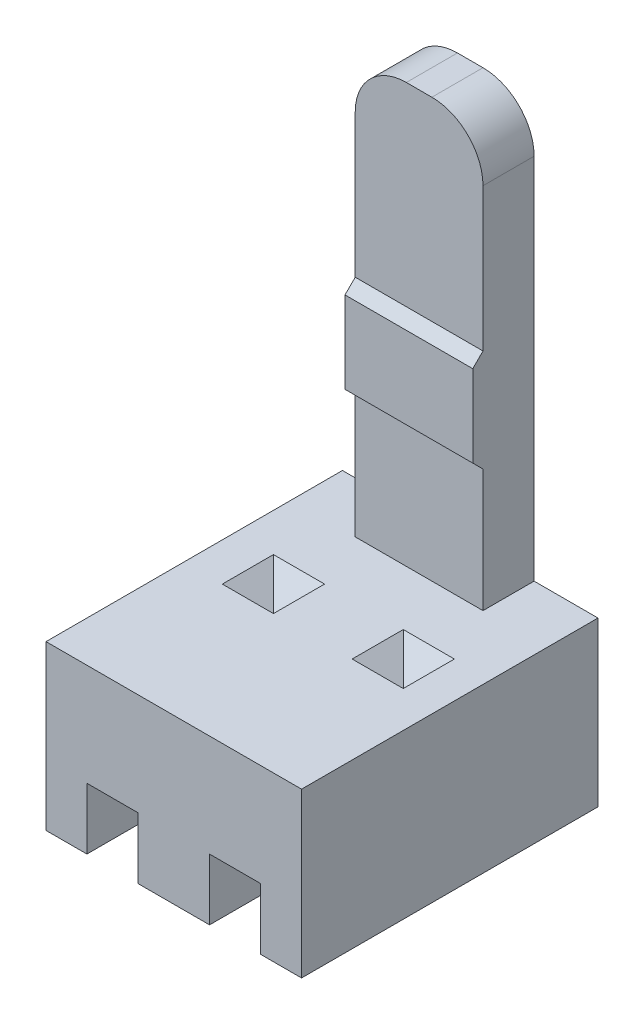
ISO-10303-21;
HEADER;
FILE_DESCRIPTION(('STEP AP214'),'2;1');
FILE_NAME('part.step','',(''),(''),'','','');
FILE_SCHEMA(('AUTOMOTIVE_DESIGN { 1 0 10303 214 1 1 1 1 }'));
ENDSEC;
DATA;
#1=APPLICATION_CONTEXT('core data for automotive mechanical design processes');
#2=APPLICATION_PROTOCOL_DEFINITION('international standard','automotive_design',2000,#1);
#3=PRODUCT_CONTEXT('',#1,'mechanical');
#4=PRODUCT('Part','Part','',(#3));
#5=PRODUCT_RELATED_PRODUCT_CATEGORY('part','',(#4));
#6=PRODUCT_DEFINITION_FORMATION('','',#4);
#7=PRODUCT_DEFINITION_CONTEXT('part definition',#1,'design');
#8=PRODUCT_DEFINITION('design','',#6,#7);
#9=PRODUCT_DEFINITION_SHAPE('','',#8);
#10=(LENGTH_UNIT() NAMED_UNIT(*) SI_UNIT(.MILLI.,.METRE.));
#11=(NAMED_UNIT(*) PLANE_ANGLE_UNIT() SI_UNIT($,.RADIAN.));
#12=(NAMED_UNIT(*) SI_UNIT($,.STERADIAN.) SOLID_ANGLE_UNIT());
#13=UNCERTAINTY_MEASURE_WITH_UNIT(LENGTH_MEASURE(1.E-05),#10,'distance_accuracy_value','');
#14=(GEOMETRIC_REPRESENTATION_CONTEXT(3) GLOBAL_UNCERTAINTY_ASSIGNED_CONTEXT((#13)) GLOBAL_UNIT_ASSIGNED_CONTEXT((#10,
#11,#12)) REPRESENTATION_CONTEXT('',''));
#15=CARTESIAN_POINT('',(0.,0.,0.));
#16=DIRECTION('',(0.,0.,1.));
#17=DIRECTION('',(1.,0.,0.));
#18=AXIS2_PLACEMENT_3D('',#15,#16,#17);
#19=CARTESIAN_POINT('',(1.25,11.4,1.));
#20=DIRECTION('',(0.,0.,-1.));
#21=DIRECTION('',(-1.,0.,0.));
#22=AXIS2_PLACEMENT_3D('',#19,#20,#21);
#23=PLANE('',#22);
#24=DIRECTION('',(1.,0.,0.));
#25=VECTOR('',#24,1.);
#26=CARTESIAN_POINT('',(1.25,5.6,1.));
#27=LINE('',#26,#25);
#28=CARTESIAN_POINT('',(1.25,5.6,1.));
#29=VERTEX_POINT('',#28);
#30=CARTESIAN_POINT('',(3.75,5.6,1.));
#31=VERTEX_POINT('',#30);
#32=EDGE_CURVE('E283',#29,#31,#27,.T.);
#33=ORIENTED_EDGE('',*,*,#32,.F.);
#34=DIRECTION('',(0.,-1.,0.));
#35=VECTOR('',#34,1.);
#36=CARTESIAN_POINT('',(1.25,11.4,1.));
#37=LINE('',#36,#35);
#38=CARTESIAN_POINT('',(1.25,3.2,1.));
#39=VERTEX_POINT('',#38);
#40=EDGE_CURVE('E456',#29,#39,#37,.T.);
#41=ORIENTED_EDGE('',*,*,#40,.T.);
#42=DIRECTION('',(1.,0.,0.));
#43=VECTOR('',#42,1.);
#44=CARTESIAN_POINT('',(1.25,3.2,1.));
#45=LINE('',#44,#43);
#46=CARTESIAN_POINT('',(3.75,3.2,1.));
#47=VERTEX_POINT('',#46);
#48=EDGE_CURVE('E321',#39,#47,#45,.T.);
#49=ORIENTED_EDGE('',*,*,#48,.T.);
#50=DIRECTION('',(0.,-1.,0.));
#51=VECTOR('',#50,1.);
#52=CARTESIAN_POINT('',(3.75,11.4,1.));
#53=LINE('',#52,#51);
#54=EDGE_CURVE('E342',#31,#47,#53,.T.);
#55=ORIENTED_EDGE('',*,*,#54,.F.);
#56=EDGE_LOOP('',(#33,#41,#49,#55));
#57=FACE_BOUND('',#56,.T.);
#58=ADVANCED_FACE('F34',(#57),#23,.F.);
#59=DIRECTION('',(1.,0.,0.));
#60=VECTOR('',#59,1.);
#61=CARTESIAN_POINT('',(1.25,11.4,1.));
#62=LINE('',#61,#60);
#63=CARTESIAN_POINT('',(2.25,11.4,1.));
#64=VERTEX_POINT('',#63);
#65=CARTESIAN_POINT('',(2.75,11.4,1.));
#66=VERTEX_POINT('',#65);
#67=EDGE_CURVE('E313',#64,#66,#62,.T.);
#68=ORIENTED_EDGE('',*,*,#67,.F.);
#69=CARTESIAN_POINT('',(2.25,10.4,1.));
#70=DIRECTION('',(0.,0.,-1.));
#71=DIRECTION('',(-1.,0.,0.));
#72=AXIS2_PLACEMENT_3D('',#69,#70,#71);
#73=CIRCLE('',#72,1.);
#74=CARTESIAN_POINT('',(1.25,10.4,1.));
#75=VERTEX_POINT('',#74);
#76=EDGE_CURVE('E364',#64,#75,#73,.F.);
#77=ORIENTED_EDGE('',*,*,#76,.T.);
#78=CARTESIAN_POINT('',(1.25,7.6,1.));
#79=VERTEX_POINT('',#78);
#80=EDGE_CURVE('E467',#75,#79,#37,.T.);
#81=ORIENTED_EDGE('',*,*,#80,.T.);
#82=DIRECTION('',(-1.,0.,0.));
#83=VECTOR('',#82,1.);
#84=CARTESIAN_POINT('',(1.25,7.6,1.));
#85=LINE('',#84,#83);
#86=CARTESIAN_POINT('',(3.75,7.6,1.));
#87=VERTEX_POINT('',#86);
#88=EDGE_CURVE('E305',#87,#79,#85,.T.);
#89=ORIENTED_EDGE('',*,*,#88,.F.);
#90=CARTESIAN_POINT('',(3.75,10.4,1.));
#91=VERTEX_POINT('',#90);
#92=EDGE_CURVE('E326',#91,#87,#53,.T.);
#93=ORIENTED_EDGE('',*,*,#92,.F.);
#94=CARTESIAN_POINT('',(2.75,10.4,1.));
#95=DIRECTION('',(0.,0.,-1.));
#96=DIRECTION('',(-1.,0.,0.));
#97=AXIS2_PLACEMENT_3D('',#94,#95,#96);
#98=CIRCLE('',#97,1.);
#99=EDGE_CURVE('E365',#91,#66,#98,.F.);
#100=ORIENTED_EDGE('',*,*,#99,.T.);
#101=EDGE_LOOP('',(#68,#77,#81,#89,#93,#100));
#102=FACE_BOUND('',#101,.T.);
#103=ADVANCED_FACE('F525',(#102),#23,.F.);
#104=CARTESIAN_POINT('',(0.,3.2,5.8));
#105=DIRECTION('',(0.,-1.,0.));
#106=DIRECTION('',(0.,0.,-1.));
#107=AXIS2_PLACEMENT_3D('',#104,#105,#106);
#108=PLANE('',#107);
#109=DIRECTION('',(1.,0.,0.));
#110=VECTOR('',#109,1.);
#111=CARTESIAN_POINT('',(3.29,3.2,3.1));
#112=LINE('',#111,#110);
#113=CARTESIAN_POINT('',(3.29,3.2,3.1));
#114=VERTEX_POINT('',#113);
#115=CARTESIAN_POINT('',(4.29,3.2,3.1));
#116=VERTEX_POINT('',#115);
#117=EDGE_CURVE('E245',#114,#116,#112,.T.);
#118=ORIENTED_EDGE('',*,*,#117,.F.);
#119=DIRECTION('',(0.,0.,1.));
#120=VECTOR('',#119,1.);
#121=CARTESIAN_POINT('',(3.29,3.2,2.1));
#122=LINE('',#121,#120);
#123=CARTESIAN_POINT('',(3.29,3.2,2.1));
#124=VERTEX_POINT('',#123);
#125=EDGE_CURVE('E49',#124,#114,#122,.T.);
#126=ORIENTED_EDGE('',*,*,#125,.F.);
#127=DIRECTION('',(-1.,0.,0.));
#128=VECTOR('',#127,1.);
#129=CARTESIAN_POINT('',(3.29,3.2,2.1));
#130=LINE('',#129,#128);
#131=CARTESIAN_POINT('',(4.29,3.2,2.1));
#132=VERTEX_POINT('',#131);
#133=EDGE_CURVE('E252',#132,#124,#130,.T.);
#134=ORIENTED_EDGE('',*,*,#133,.F.);
#135=DIRECTION('',(0.,0.,-1.));
#136=VECTOR('',#135,1.);
#137=CARTESIAN_POINT('',(4.29,3.2,2.1));
#138=LINE('',#137,#136);
#139=EDGE_CURVE('E234',#116,#132,#138,.T.);
#140=ORIENTED_EDGE('',*,*,#139,.F.);
#141=EDGE_LOOP('',(#118,#126,#134,#140));
#142=FACE_BOUND('',#141,.T.);
#143=DIRECTION('',(1.,0.,0.));
#144=VECTOR('',#143,1.);
#145=CARTESIAN_POINT('',(0.750000000000003,3.2,3.1));
#146=LINE('',#145,#144);
#147=CARTESIAN_POINT('',(0.750000000000003,3.2,3.1));
#148=VERTEX_POINT('',#147);
#149=CARTESIAN_POINT('',(1.75,3.2,3.1));
#150=VERTEX_POINT('',#149);
#151=EDGE_CURVE('E271',#148,#150,#146,.T.);
#152=ORIENTED_EDGE('',*,*,#151,.F.);
#153=DIRECTION('',(0.,0.,1.));
#154=VECTOR('',#153,1.);
#155=CARTESIAN_POINT('',(0.750000000000003,3.2,2.1));
#156=LINE('',#155,#154);
#157=CARTESIAN_POINT('',(0.750000000000003,3.2,2.1));
#158=VERTEX_POINT('',#157);
#159=EDGE_CURVE('E57',#158,#148,#156,.T.);
#160=ORIENTED_EDGE('',*,*,#159,.F.);
#161=DIRECTION('',(-1.,0.,0.));
#162=VECTOR('',#161,1.);
#163=CARTESIAN_POINT('',(0.750000000000003,3.2,2.1));
#164=LINE('',#163,#162);
#165=CARTESIAN_POINT('',(1.75,3.2,2.1));
#166=VERTEX_POINT('',#165);
#167=EDGE_CURVE('E277',#166,#158,#164,.T.);
#168=ORIENTED_EDGE('',*,*,#167,.F.);
#169=DIRECTION('',(0.,0.,-1.));
#170=VECTOR('',#169,1.);
#171=CARTESIAN_POINT('',(1.75,3.2,2.1));
#172=LINE('',#171,#170);
#173=EDGE_CURVE('E274',#150,#166,#172,.T.);
#174=ORIENTED_EDGE('',*,*,#173,.F.);
#175=EDGE_LOOP('',(#152,#160,#168,#174));
#176=FACE_BOUND('',#175,.T.);
#177=DIRECTION('',(0.,0.,1.));
#178=VECTOR('',#177,1.);
#179=CARTESIAN_POINT('',(1.25,3.2,0.));
#180=LINE('',#179,#178);
#181=CARTESIAN_POINT('',(1.25,3.2,0.));
#182=VERTEX_POINT('',#181);
#183=EDGE_CURVE('E308',#182,#39,#180,.T.);
#184=ORIENTED_EDGE('',*,*,#183,.F.);
#185=DIRECTION('',(-1.,0.,0.));
#186=VECTOR('',#185,1.);
#187=CARTESIAN_POINT('',(0.,3.2,0.));
#188=LINE('',#187,#186);
#189=CARTESIAN_POINT('',(0.,3.2,0.));
#190=VERTEX_POINT('',#189);
#191=EDGE_CURVE('E381',#182,#190,#188,.T.);
#192=ORIENTED_EDGE('',*,*,#191,.T.);
#193=DIRECTION('',(0.,0.,-1.));
#194=VECTOR('',#193,1.);
#195=CARTESIAN_POINT('',(0.,3.2,5.8));
#196=LINE('',#195,#194);
#197=CARTESIAN_POINT('',(0.,3.2,5.8));
#198=VERTEX_POINT('',#197);
#199=EDGE_CURVE('E406',#198,#190,#196,.T.);
#200=ORIENTED_EDGE('',*,*,#199,.F.);
#201=DIRECTION('',(-1.,0.,0.));
#202=VECTOR('',#201,1.);
#203=CARTESIAN_POINT('',(0.,3.2,5.8));
#204=LINE('',#203,#202);
#205=CARTESIAN_POINT('',(5.,3.2,5.8));
#206=VERTEX_POINT('',#205);
#207=EDGE_CURVE('E490',#206,#198,#204,.T.);
#208=ORIENTED_EDGE('',*,*,#207,.F.);
#209=DIRECTION('',(0.,0.,-1.));
#210=VECTOR('',#209,1.);
#211=CARTESIAN_POINT('',(5.,3.2,5.8));
#212=LINE('',#211,#210);
#213=CARTESIAN_POINT('',(5.,3.2,0.));
#214=VERTEX_POINT('',#213);
#215=EDGE_CURVE('E409',#206,#214,#212,.T.);
#216=ORIENTED_EDGE('',*,*,#215,.T.);
#217=CARTESIAN_POINT('',(3.75,3.2,0.));
#218=VERTEX_POINT('',#217);
#219=EDGE_CURVE('E388',#214,#218,#188,.T.);
#220=ORIENTED_EDGE('',*,*,#219,.T.);
#221=DIRECTION('',(0.,0.,-1.));
#222=VECTOR('',#221,1.);
#223=CARTESIAN_POINT('',(3.75,3.2,0.));
#224=LINE('',#223,#222);
#225=EDGE_CURVE('E317',#47,#218,#224,.T.);
#226=ORIENTED_EDGE('',*,*,#225,.F.);
#227=ORIENTED_EDGE('',*,*,#48,.F.);
#228=EDGE_LOOP('',(#184,#192,#200,#208,#216,#220,#226,#227));
#229=FACE_BOUND('',#228,.T.);
#230=ADVANCED_FACE('F249',(#142,#176,#229),#108,.F.);
#231=CARTESIAN_POINT('',(0.8,0.,5.8));
#232=DIRECTION('',(0.,1.,0.));
#233=DIRECTION('',(-1.,0.,0.));
#234=AXIS2_PLACEMENT_3D('',#231,#232,#233);
#235=PLANE('',#234);
#236=DIRECTION('',(1.,0.,0.));
#237=VECTOR('',#236,1.);
#238=CARTESIAN_POINT('',(0.8,0.,0.));
#239=LINE('',#238,#237);
#240=CARTESIAN_POINT('',(0.,0.,0.));
#241=VERTEX_POINT('',#240);
#242=CARTESIAN_POINT('',(0.8,0.,0.));
#243=VERTEX_POINT('',#242);
#244=EDGE_CURVE('E468',#241,#243,#239,.T.);
#245=ORIENTED_EDGE('',*,*,#244,.T.);
#246=DIRECTION('',(0.,0.,-1.));
#247=VECTOR('',#246,1.);
#248=CARTESIAN_POINT('',(0.8,0.,5.8));
#249=LINE('',#248,#247);
#250=CARTESIAN_POINT('',(0.8,0.,5.8));
#251=VERTEX_POINT('',#250);
#252=EDGE_CURVE('E435',#251,#243,#249,.T.);
#253=ORIENTED_EDGE('',*,*,#252,.F.);
#254=DIRECTION('',(1.,0.,0.));
#255=VECTOR('',#254,1.);
#256=CARTESIAN_POINT('',(0.8,0.,5.8));
#257=LINE('',#256,#255);
#258=CARTESIAN_POINT('',(0.,0.,5.8));
#259=VERTEX_POINT('',#258);
#260=EDGE_CURVE('E402',#259,#251,#257,.T.);
#261=ORIENTED_EDGE('',*,*,#260,.F.);
#262=DIRECTION('',(0.,0.,-1.));
#263=VECTOR('',#262,1.);
#264=CARTESIAN_POINT('',(0.,0.,5.8));
#265=LINE('',#264,#263);
#266=EDGE_CURVE('E403',#259,#241,#265,.T.);
#267=ORIENTED_EDGE('',*,*,#266,.T.);
#268=EDGE_LOOP('',(#245,#253,#261,#267));
#269=FACE_BOUND('',#268,.T.);
#270=ADVANCED_FACE('F558',(#269),#235,.F.);
#271=CARTESIAN_POINT('',(0.8,1.2,5.8));
#272=DIRECTION('',(-1.,0.,0.));
#273=DIRECTION('',(0.,-1.,0.));
#274=AXIS2_PLACEMENT_3D('',#271,#272,#273);
#275=PLANE('',#274);
#276=DIRECTION('',(0.,1.,0.));
#277=VECTOR('',#276,1.);
#278=CARTESIAN_POINT('',(0.8,1.2,0.));
#279=LINE('',#278,#277);
#280=CARTESIAN_POINT('',(0.8,1.2,0.));
#281=VERTEX_POINT('',#280);
#282=EDGE_CURVE('E494',#243,#281,#279,.T.);
#283=ORIENTED_EDGE('',*,*,#282,.T.);
#284=DIRECTION('',(0.,0.,-1.));
#285=VECTOR('',#284,1.);
#286=CARTESIAN_POINT('',(0.8,1.2,5.8));
#287=LINE('',#286,#285);
#288=CARTESIAN_POINT('',(0.8,1.2,5.8));
#289=VERTEX_POINT('',#288);
#290=EDGE_CURVE('E433',#289,#281,#287,.T.);
#291=ORIENTED_EDGE('',*,*,#290,.F.);
#292=DIRECTION('',(0.,1.,0.));
#293=VECTOR('',#292,1.);
#294=CARTESIAN_POINT('',(0.8,1.2,5.8));
#295=LINE('',#294,#293);
#296=EDGE_CURVE('E472',#251,#289,#295,.T.);
#297=ORIENTED_EDGE('',*,*,#296,.F.);
#298=ORIENTED_EDGE('',*,*,#252,.T.);
#299=EDGE_LOOP('',(#283,#291,#297,#298));
#300=FACE_BOUND('',#299,.T.);
#301=ADVANCED_FACE('F586',(#300),#275,.F.);
#302=CARTESIAN_POINT('',(1.8,1.2,5.8));
#303=DIRECTION('',(0.,1.,0.));
#304=DIRECTION('',(-1.,0.,0.));
#305=AXIS2_PLACEMENT_3D('',#302,#303,#304);
#306=PLANE('',#305);
#307=DIRECTION('',(1.,0.,0.));
#308=VECTOR('',#307,1.);
#309=CARTESIAN_POINT('',(1.8,1.2,0.));
#310=LINE('',#309,#308);
#311=CARTESIAN_POINT('',(1.8,1.2,0.));
#312=VERTEX_POINT('',#311);
#313=EDGE_CURVE('E496',#281,#312,#310,.T.);
#314=ORIENTED_EDGE('',*,*,#313,.T.);
#315=DIRECTION('',(0.,0.,-1.));
#316=VECTOR('',#315,1.);
#317=CARTESIAN_POINT('',(1.8,1.2,5.8));
#318=LINE('',#317,#316);
#319=CARTESIAN_POINT('',(1.8,1.2,5.8));
#320=VERTEX_POINT('',#319);
#321=EDGE_CURVE('E430',#320,#312,#318,.T.);
#322=ORIENTED_EDGE('',*,*,#321,.F.);
#323=DIRECTION('',(1.,0.,0.));
#324=VECTOR('',#323,1.);
#325=CARTESIAN_POINT('',(1.8,1.2,5.8));
#326=LINE('',#325,#324);
#327=EDGE_CURVE('E474',#289,#320,#326,.T.);
#328=ORIENTED_EDGE('',*,*,#327,.F.);
#329=ORIENTED_EDGE('',*,*,#290,.T.);
#330=EDGE_LOOP('',(#314,#322,#328,#329));
#331=FACE_BOUND('',#330,.T.);
#332=ADVANCED_FACE('F582',(#331),#306,.F.);
#333=CARTESIAN_POINT('',(1.8,0.,5.8));
#334=DIRECTION('',(1.,0.,0.));
#335=DIRECTION('',(0.,0.,-1.));
#336=AXIS2_PLACEMENT_3D('',#333,#334,#335);
#337=PLANE('',#336);
#338=DIRECTION('',(0.,-1.,0.));
#339=VECTOR('',#338,1.);
#340=CARTESIAN_POINT('',(1.8,0.,0.));
#341=LINE('',#340,#339);
#342=CARTESIAN_POINT('',(1.8,0.,0.));
#343=VERTEX_POINT('',#342);
#344=EDGE_CURVE('E498',#312,#343,#341,.T.);
#345=ORIENTED_EDGE('',*,*,#344,.T.);
#346=DIRECTION('',(0.,0.,-1.));
#347=VECTOR('',#346,1.);
#348=CARTESIAN_POINT('',(1.8,0.,5.8));
#349=LINE('',#348,#347);
#350=CARTESIAN_POINT('',(1.8,0.,5.8));
#351=VERTEX_POINT('',#350);
#352=EDGE_CURVE('E427',#351,#343,#349,.T.);
#353=ORIENTED_EDGE('',*,*,#352,.F.);
#354=DIRECTION('',(0.,-1.,0.));
#355=VECTOR('',#354,1.);
#356=CARTESIAN_POINT('',(1.8,0.,5.8));
#357=LINE('',#356,#355);
#358=EDGE_CURVE('E476',#320,#351,#357,.T.);
#359=ORIENTED_EDGE('',*,*,#358,.F.);
#360=ORIENTED_EDGE('',*,*,#321,.T.);
#361=EDGE_LOOP('',(#345,#353,#359,#360));
#362=FACE_BOUND('',#361,.T.);
#363=ADVANCED_FACE('F578',(#362),#337,.F.);
#364=CARTESIAN_POINT('',(3.2,0.,5.8));
#365=DIRECTION('',(0.,1.,0.));
#366=DIRECTION('',(-1.,0.,0.));
#367=AXIS2_PLACEMENT_3D('',#364,#365,#366);
#368=PLANE('',#367);
#369=DIRECTION('',(1.,0.,0.));
#370=VECTOR('',#369,1.);
#371=CARTESIAN_POINT('',(3.2,0.,0.));
#372=LINE('',#371,#370);
#373=CARTESIAN_POINT('',(3.2,0.,0.));
#374=VERTEX_POINT('',#373);
#375=EDGE_CURVE('E500',#343,#374,#372,.T.);
#376=ORIENTED_EDGE('',*,*,#375,.T.);
#377=DIRECTION('',(0.,0.,-1.));
#378=VECTOR('',#377,1.);
#379=CARTESIAN_POINT('',(3.2,0.,5.8));
#380=LINE('',#379,#378);
#381=CARTESIAN_POINT('',(3.2,0.,5.8));
#382=VERTEX_POINT('',#381);
#383=EDGE_CURVE('E424',#382,#374,#380,.T.);
#384=ORIENTED_EDGE('',*,*,#383,.F.);
#385=DIRECTION('',(1.,0.,0.));
#386=VECTOR('',#385,1.);
#387=CARTESIAN_POINT('',(3.2,0.,5.8));
#388=LINE('',#387,#386);
#389=EDGE_CURVE('E478',#351,#382,#388,.T.);
#390=ORIENTED_EDGE('',*,*,#389,.F.);
#391=ORIENTED_EDGE('',*,*,#352,.T.);
#392=EDGE_LOOP('',(#376,#384,#390,#391));
#393=FACE_BOUND('',#392,.T.);
#394=ADVANCED_FACE('F574',(#393),#368,.F.);
#395=CARTESIAN_POINT('',(3.2,1.2,5.8));
#396=DIRECTION('',(-1.,0.,0.));
#397=DIRECTION('',(0.,0.,1.));
#398=AXIS2_PLACEMENT_3D('',#395,#396,#397);
#399=PLANE('',#398);
#400=DIRECTION('',(0.,1.,0.));
#401=VECTOR('',#400,1.);
#402=CARTESIAN_POINT('',(3.2,1.2,0.));
#403=LINE('',#402,#401);
#404=CARTESIAN_POINT('',(3.2,1.2,0.));
#405=VERTEX_POINT('',#404);
#406=EDGE_CURVE('E502',#374,#405,#403,.T.);
#407=ORIENTED_EDGE('',*,*,#406,.T.);
#408=DIRECTION('',(0.,0.,-1.));
#409=VECTOR('',#408,1.);
#410=CARTESIAN_POINT('',(3.2,1.2,5.8));
#411=LINE('',#410,#409);
#412=CARTESIAN_POINT('',(3.2,1.2,5.8));
#413=VERTEX_POINT('',#412);
#414=EDGE_CURVE('E421',#413,#405,#411,.T.);
#415=ORIENTED_EDGE('',*,*,#414,.F.);
#416=DIRECTION('',(0.,1.,0.));
#417=VECTOR('',#416,1.);
#418=CARTESIAN_POINT('',(3.2,1.2,5.8));
#419=LINE('',#418,#417);
#420=EDGE_CURVE('E480',#382,#413,#419,.T.);
#421=ORIENTED_EDGE('',*,*,#420,.F.);
#422=ORIENTED_EDGE('',*,*,#383,.T.);
#423=EDGE_LOOP('',(#407,#415,#421,#422));
#424=FACE_BOUND('',#423,.T.);
#425=ADVANCED_FACE('F570',(#424),#399,.F.);
#426=CARTESIAN_POINT('',(4.2,1.2,5.8));
#427=DIRECTION('',(0.,1.,0.));
#428=DIRECTION('',(-1.,0.,0.));
#429=AXIS2_PLACEMENT_3D('',#426,#427,#428);
#430=PLANE('',#429);
#431=DIRECTION('',(1.,0.,0.));
#432=VECTOR('',#431,1.);
#433=CARTESIAN_POINT('',(4.2,1.2,0.));
#434=LINE('',#433,#432);
#435=CARTESIAN_POINT('',(4.2,1.2,0.));
#436=VERTEX_POINT('',#435);
#437=EDGE_CURVE('E504',#405,#436,#434,.T.);
#438=ORIENTED_EDGE('',*,*,#437,.T.);
#439=DIRECTION('',(0.,0.,-1.));
#440=VECTOR('',#439,1.);
#441=CARTESIAN_POINT('',(4.2,1.2,5.8));
#442=LINE('',#441,#440);
#443=CARTESIAN_POINT('',(4.2,1.2,5.8));
#444=VERTEX_POINT('',#443);
#445=EDGE_CURVE('E418',#444,#436,#442,.T.);
#446=ORIENTED_EDGE('',*,*,#445,.F.);
#447=DIRECTION('',(1.,0.,0.));
#448=VECTOR('',#447,1.);
#449=CARTESIAN_POINT('',(4.2,1.2,5.8));
#450=LINE('',#449,#448);
#451=EDGE_CURVE('E482',#413,#444,#450,.T.);
#452=ORIENTED_EDGE('',*,*,#451,.F.);
#453=ORIENTED_EDGE('',*,*,#414,.T.);
#454=EDGE_LOOP('',(#438,#446,#452,#453));
#455=FACE_BOUND('',#454,.T.);
#456=ADVANCED_FACE('F566',(#455),#430,.F.);
#457=CARTESIAN_POINT('',(4.2,0.,5.8));
#458=DIRECTION('',(1.,0.,0.));
#459=DIRECTION('',(0.,0.,-1.));
#460=AXIS2_PLACEMENT_3D('',#457,#458,#459);
#461=PLANE('',#460);
#462=DIRECTION('',(0.,-1.,0.));
#463=VECTOR('',#462,1.);
#464=CARTESIAN_POINT('',(4.2,0.,0.));
#465=LINE('',#464,#463);
#466=CARTESIAN_POINT('',(4.2,0.,0.));
#467=VERTEX_POINT('',#466);
#468=EDGE_CURVE('E506',#436,#467,#465,.T.);
#469=ORIENTED_EDGE('',*,*,#468,.T.);
#470=DIRECTION('',(0.,0.,-1.));
#471=VECTOR('',#470,1.);
#472=CARTESIAN_POINT('',(4.2,0.,5.8));
#473=LINE('',#472,#471);
#474=CARTESIAN_POINT('',(4.2,0.,5.8));
#475=VERTEX_POINT('',#474);
#476=EDGE_CURVE('E415',#475,#467,#473,.T.);
#477=ORIENTED_EDGE('',*,*,#476,.F.);
#478=DIRECTION('',(0.,-1.,0.));
#479=VECTOR('',#478,1.);
#480=CARTESIAN_POINT('',(4.2,0.,5.8));
#481=LINE('',#480,#479);
#482=EDGE_CURVE('E484',#444,#475,#481,.T.);
#483=ORIENTED_EDGE('',*,*,#482,.F.);
#484=ORIENTED_EDGE('',*,*,#445,.T.);
#485=EDGE_LOOP('',(#469,#477,#483,#484));
#486=FACE_BOUND('',#485,.T.);
#487=ADVANCED_FACE('F563',(#486),#461,.F.);
#488=CARTESIAN_POINT('',(5.,0.,5.8));
#489=DIRECTION('',(0.,1.,0.));
#490=DIRECTION('',(-1.,0.,0.));
#491=AXIS2_PLACEMENT_3D('',#488,#489,#490);
#492=PLANE('',#491);
#493=DIRECTION('',(1.,0.,0.));
#494=VECTOR('',#493,1.);
#495=CARTESIAN_POINT('',(5.,0.,0.));
#496=LINE('',#495,#494);
#497=CARTESIAN_POINT('',(5.,0.,0.));
#498=VERTEX_POINT('',#497);
#499=EDGE_CURVE('E393',#467,#498,#496,.T.);
#500=ORIENTED_EDGE('',*,*,#499,.T.);
#501=DIRECTION('',(0.,0.,-1.));
#502=VECTOR('',#501,1.);
#503=CARTESIAN_POINT('',(5.,0.,5.8));
#504=LINE('',#503,#502);
#505=CARTESIAN_POINT('',(5.,0.,5.8));
#506=VERTEX_POINT('',#505);
#507=EDGE_CURVE('E412',#506,#498,#504,.T.);
#508=ORIENTED_EDGE('',*,*,#507,.F.);
#509=DIRECTION('',(1.,0.,0.));
#510=VECTOR('',#509,1.);
#511=CARTESIAN_POINT('',(5.,0.,5.8));
#512=LINE('',#511,#510);
#513=EDGE_CURVE('E486',#475,#506,#512,.T.);
#514=ORIENTED_EDGE('',*,*,#513,.F.);
#515=ORIENTED_EDGE('',*,*,#476,.T.);
#516=EDGE_LOOP('',(#500,#508,#514,#515));
#517=FACE_BOUND('',#516,.T.);
#518=ADVANCED_FACE('F510',(#517),#492,.F.);
#519=CARTESIAN_POINT('',(5.,3.2,5.8));
#520=DIRECTION('',(-1.,0.,0.));
#521=DIRECTION('',(0.,-1.,0.));
#522=AXIS2_PLACEMENT_3D('',#519,#520,#521);
#523=PLANE('',#522);
#524=DIRECTION('',(0.,1.,0.));
#525=VECTOR('',#524,1.);
#526=CARTESIAN_POINT('',(5.,3.2,0.));
#527=LINE('',#526,#525);
#528=EDGE_CURVE('E389',#498,#214,#527,.T.);
#529=ORIENTED_EDGE('',*,*,#528,.T.);
#530=ORIENTED_EDGE('',*,*,#215,.F.);
#531=DIRECTION('',(0.,1.,0.));
#532=VECTOR('',#531,1.);
#533=CARTESIAN_POINT('',(5.,3.2,5.8));
#534=LINE('',#533,#532);
#535=EDGE_CURVE('E488',#506,#206,#534,.T.);
#536=ORIENTED_EDGE('',*,*,#535,.F.);
#537=ORIENTED_EDGE('',*,*,#507,.T.);
#538=EDGE_LOOP('',(#529,#530,#536,#537));
#539=FACE_BOUND('',#538,.T.);
#540=ADVANCED_FACE('F517',(#539),#523,.F.);
#541=CARTESIAN_POINT('',(0.,0.,5.8));
#542=DIRECTION('',(1.,0.,0.));
#543=DIRECTION('',(0.,1.,0.));
#544=AXIS2_PLACEMENT_3D('',#541,#542,#543);
#545=PLANE('',#544);
#546=DIRECTION('',(0.,-1.,0.));
#547=VECTOR('',#546,1.);
#548=CARTESIAN_POINT('',(0.,0.,0.));
#549=LINE('',#548,#547);
#550=EDGE_CURVE('E387',#190,#241,#549,.T.);
#551=ORIENTED_EDGE('',*,*,#550,.T.);
#552=ORIENTED_EDGE('',*,*,#266,.F.);
#553=DIRECTION('',(0.,-1.,0.));
#554=VECTOR('',#553,1.);
#555=CARTESIAN_POINT('',(0.,0.,5.8));
#556=LINE('',#555,#554);
#557=EDGE_CURVE('E407',#198,#259,#556,.T.);
#558=ORIENTED_EDGE('',*,*,#557,.F.);
#559=ORIENTED_EDGE('',*,*,#199,.T.);
#560=EDGE_LOOP('',(#551,#552,#558,#559));
#561=FACE_BOUND('',#560,.T.);
#562=ADVANCED_FACE('F549',(#561),#545,.F.);
#563=CARTESIAN_POINT('',(0.,0.,5.8));
#564=DIRECTION('',(0.,0.,-1.));
#565=DIRECTION('',(-1.,0.,0.));
#566=AXIS2_PLACEMENT_3D('',#563,#564,#565);
#567=PLANE('',#566);
#568=ORIENTED_EDGE('',*,*,#260,.T.);
#569=ORIENTED_EDGE('',*,*,#296,.T.);
#570=ORIENTED_EDGE('',*,*,#327,.T.);
#571=ORIENTED_EDGE('',*,*,#358,.T.);
#572=ORIENTED_EDGE('',*,*,#389,.T.);
#573=ORIENTED_EDGE('',*,*,#420,.T.);
#574=ORIENTED_EDGE('',*,*,#451,.T.);
#575=ORIENTED_EDGE('',*,*,#482,.T.);
#576=ORIENTED_EDGE('',*,*,#513,.T.);
#577=ORIENTED_EDGE('',*,*,#535,.T.);
#578=ORIENTED_EDGE('',*,*,#207,.T.);
#579=ORIENTED_EDGE('',*,*,#557,.T.);
#580=EDGE_LOOP('',(#568,#569,#570,#571,#572,#573,#574,#575,#576,#577,#578,#579));
#581=FACE_BOUND('',#580,.T.);
#582=ADVANCED_FACE('F546',(#581),#567,.F.);
#583=CARTESIAN_POINT('',(0.,0.,0.));
#584=DIRECTION('',(0.,0.,-1.));
#585=DIRECTION('',(-1.,0.,0.));
#586=AXIS2_PLACEMENT_3D('',#583,#584,#585);
#587=PLANE('',#586);
#588=DIRECTION('',(0.,-1.,0.));
#589=VECTOR('',#588,1.);
#590=CARTESIAN_POINT('',(1.25,11.4,0.));
#591=LINE('',#590,#589);
#592=CARTESIAN_POINT('',(1.25,10.4,0.));
#593=VERTEX_POINT('',#592);
#594=EDGE_CURVE('E320',#593,#182,#591,.T.);
#595=ORIENTED_EDGE('',*,*,#594,.F.);
#596=CARTESIAN_POINT('',(2.25,10.4,0.));
#597=DIRECTION('',(0.,0.,-1.));
#598=DIRECTION('',(-1.,0.,0.));
#599=AXIS2_PLACEMENT_3D('',#596,#597,#598);
#600=CIRCLE('',#599,1.);
#601=CARTESIAN_POINT('',(2.25,11.4,0.));
#602=VERTEX_POINT('',#601);
#603=EDGE_CURVE('E42',#593,#602,#600,.T.);
#604=ORIENTED_EDGE('',*,*,#603,.T.);
#605=DIRECTION('',(-1.,0.,0.));
#606=VECTOR('',#605,1.);
#607=CARTESIAN_POINT('',(1.25,11.4,0.));
#608=LINE('',#607,#606);
#609=CARTESIAN_POINT('',(2.75,11.4,0.));
#610=VERTEX_POINT('',#609);
#611=EDGE_CURVE('E316',#610,#602,#608,.T.);
#612=ORIENTED_EDGE('',*,*,#611,.F.);
#613=CARTESIAN_POINT('',(2.75,10.4,0.));
#614=DIRECTION('',(0.,0.,-1.));
#615=DIRECTION('',(-1.,0.,0.));
#616=AXIS2_PLACEMENT_3D('',#613,#614,#615);
#617=CIRCLE('',#616,1.);
#618=CARTESIAN_POINT('',(3.75,10.4,0.));
#619=VERTEX_POINT('',#618);
#620=EDGE_CURVE('E345',#610,#619,#617,.T.);
#621=ORIENTED_EDGE('',*,*,#620,.T.);
#622=DIRECTION('',(0.,-1.,0.));
#623=VECTOR('',#622,1.);
#624=CARTESIAN_POINT('',(3.75,11.4,0.));
#625=LINE('',#624,#623);
#626=EDGE_CURVE('E339',#619,#218,#625,.T.);
#627=ORIENTED_EDGE('',*,*,#626,.T.);
#628=ORIENTED_EDGE('',*,*,#219,.F.);
#629=ORIENTED_EDGE('',*,*,#528,.F.);
#630=ORIENTED_EDGE('',*,*,#499,.F.);
#631=ORIENTED_EDGE('',*,*,#468,.F.);
#632=ORIENTED_EDGE('',*,*,#437,.F.);
#633=ORIENTED_EDGE('',*,*,#406,.F.);
#634=ORIENTED_EDGE('',*,*,#375,.F.);
#635=ORIENTED_EDGE('',*,*,#344,.F.);
#636=ORIENTED_EDGE('',*,*,#313,.F.);
#637=ORIENTED_EDGE('',*,*,#282,.F.);
#638=ORIENTED_EDGE('',*,*,#244,.F.);
#639=ORIENTED_EDGE('',*,*,#550,.F.);
#640=ORIENTED_EDGE('',*,*,#191,.F.);
#641=EDGE_LOOP('',(#595,#604,#612,#621,#627,#628,#629,#630,#631,#632,#633,#634,#635,#636,#637,
#638,#639,#640));
#642=FACE_BOUND('',#641,.T.);
#643=ADVANCED_FACE('F350',(#642),#587,.T.);
#644=CARTESIAN_POINT('',(1.25,11.4,0.));
#645=DIRECTION('',(1.,0.,0.));
#646=DIRECTION('',(0.,0.,-1.));
#647=AXIS2_PLACEMENT_3D('',#644,#645,#646);
#648=PLANE('',#647);
#649=ORIENTED_EDGE('',*,*,#80,.F.);
#650=DIRECTION('',(0.,0.,1.));
#651=VECTOR('',#650,1.);
#652=CARTESIAN_POINT('',(1.25,10.4,0.));
#653=LINE('',#652,#651);
#654=EDGE_CURVE('E343',#75,#593,#653,.F.);
#655=ORIENTED_EDGE('',*,*,#654,.T.);
#656=ORIENTED_EDGE('',*,*,#594,.T.);
#657=ORIENTED_EDGE('',*,*,#183,.T.);
#658=ORIENTED_EDGE('',*,*,#40,.F.);
#659=DIRECTION('',(0.,-0.707106781186548,-0.707106781186548));
#660=VECTOR('',#659,1.);
#661=CARTESIAN_POINT('',(1.25,5.79999999999999,1.2));
#662=LINE('',#661,#660);
#663=CARTESIAN_POINT('',(1.25,5.79999999999999,1.2));
#664=VERTEX_POINT('',#663);
#665=EDGE_CURVE('E368',#29,#664,#662,.F.);
#666=ORIENTED_EDGE('',*,*,#665,.T.);
#667=DIRECTION('',(0.,-1.,0.));
#668=VECTOR('',#667,1.);
#669=CARTESIAN_POINT('',(1.25,5.6,1.2));
#670=LINE('',#669,#668);
#671=CARTESIAN_POINT('',(1.25,7.4,1.2));
#672=VERTEX_POINT('',#671);
#673=EDGE_CURVE('E301',#672,#664,#670,.T.);
#674=ORIENTED_EDGE('',*,*,#673,.F.);
#675=DIRECTION('',(0.,-0.707106781186548,0.707106781186548));
#676=VECTOR('',#675,1.);
#677=CARTESIAN_POINT('',(1.25,7.4,1.2));
#678=LINE('',#677,#676);
#679=EDGE_CURVE('E453',#672,#79,#678,.F.);
#680=ORIENTED_EDGE('',*,*,#679,.T.);
#681=EDGE_LOOP('',(#649,#655,#656,#657,#658,#666,#674,#680));
#682=FACE_BOUND('',#681,.T.);
#683=ADVANCED_FACE('F376',(#682),#648,.F.);
#684=CARTESIAN_POINT('',(3.75,11.4,0.));
#685=DIRECTION('',(-1.,0.,0.));
#686=DIRECTION('',(0.,0.,1.));
#687=AXIS2_PLACEMENT_3D('',#684,#685,#686);
#688=PLANE('',#687);
#689=ORIENTED_EDGE('',*,*,#626,.F.);
#690=DIRECTION('',(0.,0.,-1.));
#691=VECTOR('',#690,1.);
#692=CARTESIAN_POINT('',(3.75,10.4,1.));
#693=LINE('',#692,#691);
#694=EDGE_CURVE('E11',#619,#91,#693,.F.);
#695=ORIENTED_EDGE('',*,*,#694,.T.);
#696=ORIENTED_EDGE('',*,*,#92,.T.);
#697=DIRECTION('',(0.,0.707106781186548,-0.707106781186548));
#698=VECTOR('',#697,1.);
#699=CARTESIAN_POINT('',(3.75,7.4,1.2));
#700=LINE('',#699,#698);
#701=CARTESIAN_POINT('',(3.75,7.4,1.2));
#702=VERTEX_POINT('',#701);
#703=EDGE_CURVE('E446',#87,#702,#700,.F.);
#704=ORIENTED_EDGE('',*,*,#703,.T.);
#705=DIRECTION('',(0.,1.,0.));
#706=VECTOR('',#705,1.);
#707=CARTESIAN_POINT('',(3.75,5.6,1.2));
#708=LINE('',#707,#706);
#709=CARTESIAN_POINT('',(3.75,5.79999999999999,1.2));
#710=VERTEX_POINT('',#709);
#711=EDGE_CURVE('E304',#710,#702,#708,.T.);
#712=ORIENTED_EDGE('',*,*,#711,.F.);
#713=DIRECTION('',(0.,0.707106781186548,0.707106781186548));
#714=VECTOR('',#713,1.);
#715=CARTESIAN_POINT('',(3.75,5.79999999999999,1.2));
#716=LINE('',#715,#714);
#717=EDGE_CURVE('E449',#710,#31,#716,.F.);
#718=ORIENTED_EDGE('',*,*,#717,.T.);
#719=ORIENTED_EDGE('',*,*,#54,.T.);
#720=ORIENTED_EDGE('',*,*,#225,.T.);
#721=EDGE_LOOP('',(#689,#695,#696,#704,#712,#718,#719,#720));
#722=FACE_BOUND('',#721,.T.);
#723=ADVANCED_FACE('F463',(#722),#688,.F.);
#724=CARTESIAN_POINT('',(0.,11.4,0.));
#725=DIRECTION('',(0.,1.,0.));
#726=DIRECTION('',(0.,0.,1.));
#727=AXIS2_PLACEMENT_3D('',#724,#725,#726);
#728=PLANE('',#727);
#729=ORIENTED_EDGE('',*,*,#611,.T.);
#730=DIRECTION('',(0.,0.,1.));
#731=VECTOR('',#730,1.);
#732=CARTESIAN_POINT('',(2.25,11.4,1.));
#733=LINE('',#732,#731);
#734=EDGE_CURVE('E359',#602,#64,#733,.T.);
#735=ORIENTED_EDGE('',*,*,#734,.T.);
#736=ORIENTED_EDGE('',*,*,#67,.T.);
#737=DIRECTION('',(0.,0.,-1.));
#738=VECTOR('',#737,1.);
#739=CARTESIAN_POINT('',(2.75,11.4,0.));
#740=LINE('',#739,#738);
#741=EDGE_CURVE('E362',#66,#610,#740,.T.);
#742=ORIENTED_EDGE('',*,*,#741,.T.);
#743=EDGE_LOOP('',(#729,#735,#736,#742));
#744=FACE_BOUND('',#743,.T.);
#745=ADVANCED_FACE('F358',(#744),#728,.T.);
#746=CARTESIAN_POINT('',(0.,0.,1.2));
#747=DIRECTION('',(0.,0.,-1.));
#748=DIRECTION('',(-1.,0.,0.));
#749=AXIS2_PLACEMENT_3D('',#746,#747,#748);
#750=PLANE('',#749);
#751=ORIENTED_EDGE('',*,*,#673,.T.);
#752=DIRECTION('',(1.,0.,0.));
#753=VECTOR('',#752,1.);
#754=CARTESIAN_POINT('',(0.,5.79999999999999,1.2));
#755=LINE('',#754,#753);
#756=EDGE_CURVE('E441',#664,#710,#755,.T.);
#757=ORIENTED_EDGE('',*,*,#756,.T.);
#758=ORIENTED_EDGE('',*,*,#711,.T.);
#759=DIRECTION('',(-1.,0.,0.));
#760=VECTOR('',#759,1.);
#761=CARTESIAN_POINT('',(0.,7.4,1.2));
#762=LINE('',#761,#760);
#763=EDGE_CURVE('E336',#702,#672,#762,.T.);
#764=ORIENTED_EDGE('',*,*,#763,.T.);
#765=EDGE_LOOP('',(#751,#757,#758,#764));
#766=FACE_BOUND('',#765,.T.);
#767=ADVANCED_FACE('F458',(#766),#750,.F.);
#768=CARTESIAN_POINT('',(0.,5.79999999999999,1.2));
#769=DIRECTION('',(0.,0.707106781186548,-0.707106781186548));
#770=DIRECTION('',(1.,0.,0.));
#771=AXIS2_PLACEMENT_3D('',#768,#769,#770);
#772=PLANE('',#771);
#773=ORIENTED_EDGE('',*,*,#665,.F.);
#774=ORIENTED_EDGE('',*,*,#32,.T.);
#775=ORIENTED_EDGE('',*,*,#717,.F.);
#776=ORIENTED_EDGE('',*,*,#756,.F.);
#777=EDGE_LOOP('',(#773,#774,#775,#776));
#778=FACE_BOUND('',#777,.T.);
#779=ADVANCED_FACE('F459',(#778),#772,.F.);
#780=CARTESIAN_POINT('',(0.,7.4,1.2));
#781=DIRECTION('',(0.,-0.707106781186548,-0.707106781186548));
#782=DIRECTION('',(-1.,0.,0.));
#783=AXIS2_PLACEMENT_3D('',#780,#781,#782);
#784=PLANE('',#783);
#785=ORIENTED_EDGE('',*,*,#703,.F.);
#786=ORIENTED_EDGE('',*,*,#88,.T.);
#787=ORIENTED_EDGE('',*,*,#679,.F.);
#788=ORIENTED_EDGE('',*,*,#763,.F.);
#789=EDGE_LOOP('',(#785,#786,#787,#788));
#790=FACE_BOUND('',#789,.T.);
#791=ADVANCED_FACE('F528',(#790),#784,.F.);
#792=CARTESIAN_POINT('',(2.25,10.4,0.));
#793=DIRECTION('',(0.,0.,-1.));
#794=DIRECTION('',(-1.,0.,0.));
#795=AXIS2_PLACEMENT_3D('',#792,#793,#794);
#796=CYLINDRICAL_SURFACE('',#795,1.);
#797=ORIENTED_EDGE('',*,*,#603,.F.);
#798=ORIENTED_EDGE('',*,*,#654,.F.);
#799=ORIENTED_EDGE('',*,*,#76,.F.);
#800=ORIENTED_EDGE('',*,*,#734,.F.);
#801=EDGE_LOOP('',(#797,#798,#799,#800));
#802=FACE_BOUND('',#801,.T.);
#803=ADVANCED_FACE('F363',(#802),#796,.T.);
#804=CARTESIAN_POINT('',(2.75,10.4,0.));
#805=DIRECTION('',(0.,0.,1.));
#806=DIRECTION('',(1.,0.,0.));
#807=AXIS2_PLACEMENT_3D('',#804,#805,#806);
#808=CYLINDRICAL_SURFACE('',#807,1.);
#809=ORIENTED_EDGE('',*,*,#99,.F.);
#810=ORIENTED_EDGE('',*,*,#694,.F.);
#811=ORIENTED_EDGE('',*,*,#620,.F.);
#812=ORIENTED_EDGE('',*,*,#741,.F.);
#813=EDGE_LOOP('',(#809,#810,#811,#812));
#814=FACE_BOUND('',#813,.T.);
#815=ADVANCED_FACE('F36',(#814),#808,.T.);
#816=CARTESIAN_POINT('',(0.750000000000003,3.2,2.1));
#817=DIRECTION('',(-0.719339800338651,-0.694658370458998,0.));
#818=DIRECTION('',(0.694658370458998,-0.719339800338651,0.));
#819=AXIS2_PLACEMENT_3D('',#816,#817,#818);
#820=PLANE('',#819);
#821=ORIENTED_EDGE('',*,*,#159,.T.);
#822=DIRECTION('',(-0.570514335805199,0.590784889178375,0.570514335805199));
#823=VECTOR('',#822,1.);
#824=CARTESIAN_POINT('',(1.07548660735925,2.86294875134665,2.77451339264075));
#825=LINE('',#824,#823);
#826=CARTESIAN_POINT('',(1.23284438740354,2.7,2.61715561259646));
#827=VERTEX_POINT('',#826);
#828=EDGE_CURVE('E285',#827,#148,#825,.T.);
#829=ORIENTED_EDGE('',*,*,#828,.F.);
#830=DIRECTION('',(0.,0.,1.));
#831=VECTOR('',#830,1.);
#832=CARTESIAN_POINT('',(1.23284438740354,2.7,0.));
#833=LINE('',#832,#831);
#834=CARTESIAN_POINT('',(1.23284438740354,2.7,2.58284438740354));
#835=VERTEX_POINT('',#834);
#836=EDGE_CURVE('E280',#835,#827,#833,.T.);
#837=ORIENTED_EDGE('',*,*,#836,.F.);
#838=DIRECTION('',(-0.570514335805199,0.590784889178375,-0.570514335805199));
#839=VECTOR('',#838,1.);
#840=CARTESIAN_POINT('',(0.750000000000003,3.2,2.1));
#841=LINE('',#840,#839);
#842=EDGE_CURVE('E281',#835,#158,#841,.T.);
#843=ORIENTED_EDGE('',*,*,#842,.T.);
#844=EDGE_LOOP('',(#821,#829,#837,#843));
#845=FACE_BOUND('',#844,.T.);
#846=ADVANCED_FACE('F786',(#845),#820,.F.);
#847=CARTESIAN_POINT('',(0.750000000000003,3.2,2.1));
#848=DIRECTION('',(0.,-0.694658370458998,-0.719339800338651));
#849=DIRECTION('',(0.,0.719339800338651,-0.694658370458998));
#850=AXIS2_PLACEMENT_3D('',#847,#848,#849);
#851=PLANE('',#850);
#852=ORIENTED_EDGE('',*,*,#167,.T.);
#853=ORIENTED_EDGE('',*,*,#842,.F.);
#854=DIRECTION('',(-1.,0.,0.));
#855=VECTOR('',#854,1.);
#856=CARTESIAN_POINT('',(0.,2.7,2.58284438740354));
#857=LINE('',#856,#855);
#858=CARTESIAN_POINT('',(1.26715561259647,2.7,2.58284438740354));
#859=VERTEX_POINT('',#858);
#860=EDGE_CURVE('E288',#859,#835,#857,.T.);
#861=ORIENTED_EDGE('',*,*,#860,.F.);
#862=DIRECTION('',(0.570514335805199,0.590784889178375,-0.570514335805199));
#863=VECTOR('',#862,1.);
#864=CARTESIAN_POINT('',(1.75,3.2,2.1));
#865=LINE('',#864,#863);
#866=EDGE_CURVE('E284',#859,#166,#865,.T.);
#867=ORIENTED_EDGE('',*,*,#866,.T.);
#868=EDGE_LOOP('',(#852,#853,#861,#867));
#869=FACE_BOUND('',#868,.T.);
#870=ADVANCED_FACE('F789',(#869),#851,.F.);
#871=CARTESIAN_POINT('',(1.75,3.2,2.1));
#872=DIRECTION('',(0.719339800338651,-0.694658370458998,0.));
#873=DIRECTION('',(0.694658370458998,0.719339800338651,0.));
#874=AXIS2_PLACEMENT_3D('',#871,#872,#873);
#875=PLANE('',#874);
#876=ORIENTED_EDGE('',*,*,#173,.T.);
#877=ORIENTED_EDGE('',*,*,#866,.F.);
#878=DIRECTION('',(0.,0.,-1.));
#879=VECTOR('',#878,1.);
#880=CARTESIAN_POINT('',(1.26715561259646,2.7,0.));
#881=LINE('',#880,#879);
#882=CARTESIAN_POINT('',(1.26715561259647,2.7,2.61715561259646));
#883=VERTEX_POINT('',#882);
#884=EDGE_CURVE('E296',#883,#859,#881,.T.);
#885=ORIENTED_EDGE('',*,*,#884,.F.);
#886=DIRECTION('',(0.570514335805199,0.590784889178375,0.570514335805199));
#887=VECTOR('',#886,1.);
#888=CARTESIAN_POINT('',(1.42451339264076,2.86294875134665,2.77451339264075));
#889=LINE('',#888,#887);
#890=EDGE_CURVE('E287',#883,#150,#889,.T.);
#891=ORIENTED_EDGE('',*,*,#890,.T.);
#892=EDGE_LOOP('',(#876,#877,#885,#891));
#893=FACE_BOUND('',#892,.T.);
#894=ADVANCED_FACE('F792',(#893),#875,.F.);
#895=CARTESIAN_POINT('',(0.750000000000003,3.2,3.1));
#896=DIRECTION('',(0.,-0.694658370458998,0.719339800338651));
#897=DIRECTION('',(0.,-0.719339800338651,-0.694658370458998));
#898=AXIS2_PLACEMENT_3D('',#895,#896,#897);
#899=PLANE('',#898);
#900=ORIENTED_EDGE('',*,*,#151,.T.);
#901=ORIENTED_EDGE('',*,*,#890,.F.);
#902=DIRECTION('',(1.,0.,0.));
#903=VECTOR('',#902,1.);
#904=CARTESIAN_POINT('',(0.,2.7,2.61715561259646));
#905=LINE('',#904,#903);
#906=EDGE_CURVE('E293',#827,#883,#905,.T.);
#907=ORIENTED_EDGE('',*,*,#906,.F.);
#908=ORIENTED_EDGE('',*,*,#828,.T.);
#909=EDGE_LOOP('',(#900,#901,#907,#908));
#910=FACE_BOUND('',#909,.T.);
#911=ADVANCED_FACE('F784',(#910),#899,.F.);
#912=CARTESIAN_POINT('',(0.,2.7,0.));
#913=DIRECTION('',(0.,1.,0.));
#914=DIRECTION('',(0.,0.,1.));
#915=AXIS2_PLACEMENT_3D('',#912,#913,#914);
#916=PLANE('',#915);
#917=ORIENTED_EDGE('',*,*,#836,.T.);
#918=ORIENTED_EDGE('',*,*,#906,.T.);
#919=ORIENTED_EDGE('',*,*,#884,.T.);
#920=ORIENTED_EDGE('',*,*,#860,.T.);
#921=EDGE_LOOP('',(#917,#918,#919,#920));
#922=FACE_BOUND('',#921,.T.);
#923=ADVANCED_FACE('F733',(#922),#916,.T.);
#924=CARTESIAN_POINT('',(3.29,3.2,2.1));
#925=DIRECTION('',(-0.719339800338651,-0.694658370458998,0.));
#926=DIRECTION('',(0.694658370458998,-0.719339800338651,0.));
#927=AXIS2_PLACEMENT_3D('',#924,#925,#926);
#928=PLANE('',#927);
#929=ORIENTED_EDGE('',*,*,#125,.T.);
#930=DIRECTION('',(-0.570514335805199,0.590784889178375,0.570514335805199));
#931=VECTOR('',#930,1.);
#932=CARTESIAN_POINT('',(3.61548660735925,2.86294875134665,2.77451339264075));
#933=LINE('',#932,#931);
#934=CARTESIAN_POINT('',(3.77284438740354,2.7,2.61715561259646));
#935=VERTEX_POINT('',#934);
#936=EDGE_CURVE('E242',#935,#114,#933,.T.);
#937=ORIENTED_EDGE('',*,*,#936,.F.);
#938=DIRECTION('',(0.,0.,1.));
#939=VECTOR('',#938,1.);
#940=CARTESIAN_POINT('',(3.77284438740354,2.7,0.));
#941=LINE('',#940,#939);
#942=CARTESIAN_POINT('',(3.77284438740354,2.7,2.58284438740354));
#943=VERTEX_POINT('',#942);
#944=EDGE_CURVE('E254',#943,#935,#941,.T.);
#945=ORIENTED_EDGE('',*,*,#944,.F.);
#946=DIRECTION('',(-0.570514335805199,0.590784889178375,-0.570514335805199));
#947=VECTOR('',#946,1.);
#948=CARTESIAN_POINT('',(3.29,3.2,2.1));
#949=LINE('',#948,#947);
#950=EDGE_CURVE('E258',#943,#124,#949,.T.);
#951=ORIENTED_EDGE('',*,*,#950,.T.);
#952=EDGE_LOOP('',(#929,#937,#945,#951));
#953=FACE_BOUND('',#952,.T.);
#954=ADVANCED_FACE('F738',(#953),#928,.F.);
#955=CARTESIAN_POINT('',(3.29,3.2,2.1));
#956=DIRECTION('',(0.,-0.694658370458998,-0.719339800338651));
#957=DIRECTION('',(0.,0.719339800338651,-0.694658370458998));
#958=AXIS2_PLACEMENT_3D('',#955,#956,#957);
#959=PLANE('',#958);
#960=ORIENTED_EDGE('',*,*,#133,.T.);
#961=ORIENTED_EDGE('',*,*,#950,.F.);
#962=DIRECTION('',(-1.,0.,0.));
#963=VECTOR('',#962,1.);
#964=CARTESIAN_POINT('',(2.54,2.7,2.58284438740354));
#965=LINE('',#964,#963);
#966=CARTESIAN_POINT('',(3.80715561259647,2.7,2.58284438740354));
#967=VERTEX_POINT('',#966);
#968=EDGE_CURVE('E260',#967,#943,#965,.T.);
#969=ORIENTED_EDGE('',*,*,#968,.F.);
#970=DIRECTION('',(0.570514335805199,0.590784889178375,-0.570514335805199));
#971=VECTOR('',#970,1.);
#972=CARTESIAN_POINT('',(4.29,3.2,2.1));
#973=LINE('',#972,#971);
#974=EDGE_CURVE('E241',#967,#132,#973,.T.);
#975=ORIENTED_EDGE('',*,*,#974,.T.);
#976=EDGE_LOOP('',(#960,#961,#969,#975));
#977=FACE_BOUND('',#976,.T.);
#978=ADVANCED_FACE('F743',(#977),#959,.F.);
#979=CARTESIAN_POINT('',(4.29,3.2,2.1));
#980=DIRECTION('',(0.719339800338651,-0.694658370458998,0.));
#981=DIRECTION('',(0.694658370458998,0.719339800338651,0.));
#982=AXIS2_PLACEMENT_3D('',#979,#980,#981);
#983=PLANE('',#982);
#984=ORIENTED_EDGE('',*,*,#139,.T.);
#985=ORIENTED_EDGE('',*,*,#974,.F.);
#986=DIRECTION('',(0.,0.,-1.));
#987=VECTOR('',#986,1.);
#988=CARTESIAN_POINT('',(3.80715561259646,2.7,0.));
#989=LINE('',#988,#987);
#990=CARTESIAN_POINT('',(3.80715561259647,2.7,2.61715561259646));
#991=VERTEX_POINT('',#990);
#992=EDGE_CURVE('E237',#991,#967,#989,.T.);
#993=ORIENTED_EDGE('',*,*,#992,.F.);
#994=DIRECTION('',(0.570514335805199,0.590784889178375,0.570514335805199));
#995=VECTOR('',#994,1.);
#996=CARTESIAN_POINT('',(3.96451339264076,2.86294875134665,2.77451339264075));
#997=LINE('',#996,#995);
#998=EDGE_CURVE('E230',#991,#116,#997,.T.);
#999=ORIENTED_EDGE('',*,*,#998,.T.);
#1000=EDGE_LOOP('',(#984,#985,#993,#999));
#1001=FACE_BOUND('',#1000,.T.);
#1002=ADVANCED_FACE('F232',(#1001),#983,.F.);
#1003=CARTESIAN_POINT('',(3.29,3.2,3.1));
#1004=DIRECTION('',(0.,-0.694658370458998,0.719339800338651));
#1005=DIRECTION('',(0.,-0.719339800338651,-0.694658370458998));
#1006=AXIS2_PLACEMENT_3D('',#1003,#1004,#1005);
#1007=PLANE('',#1006);
#1008=ORIENTED_EDGE('',*,*,#117,.T.);
#1009=ORIENTED_EDGE('',*,*,#998,.F.);
#1010=DIRECTION('',(1.,0.,0.));
#1011=VECTOR('',#1010,1.);
#1012=CARTESIAN_POINT('',(2.54,2.7,2.61715561259646));
#1013=LINE('',#1012,#1011);
#1014=EDGE_CURVE('E265',#935,#991,#1013,.T.);
#1015=ORIENTED_EDGE('',*,*,#1014,.F.);
#1016=ORIENTED_EDGE('',*,*,#936,.T.);
#1017=EDGE_LOOP('',(#1008,#1009,#1015,#1016));
#1018=FACE_BOUND('',#1017,.T.);
#1019=ADVANCED_FACE('F246',(#1018),#1007,.F.);
#1020=CARTESIAN_POINT('',(2.54,2.7,0.));
#1021=DIRECTION('',(0.,1.,0.));
#1022=DIRECTION('',(0.,0.,1.));
#1023=AXIS2_PLACEMENT_3D('',#1020,#1021,#1022);
#1024=PLANE('',#1023);
#1025=ORIENTED_EDGE('',*,*,#944,.T.);
#1026=ORIENTED_EDGE('',*,*,#1014,.T.);
#1027=ORIENTED_EDGE('',*,*,#992,.T.);
#1028=ORIENTED_EDGE('',*,*,#968,.T.);
#1029=EDGE_LOOP('',(#1025,#1026,#1027,#1028));
#1030=FACE_BOUND('',#1029,.T.);
#1031=ADVANCED_FACE('F769',(#1030),#1024,.T.);
#1032=CLOSED_SHELL('',(#58,#103,#230,#270,#301,#332,#363,#394,#425,#456,#487,#518,#540,#562,
#582,#643,#683,#723,#745,#767,#779,#791,#803,#815,#846,#870,#894,#911,#923,#954,#978,#1002,
#1019,#1031));
#1033=MANIFOLD_SOLID_BREP('B2',#1032);
#1034=ADVANCED_BREP_SHAPE_REPRESENTATION('',(#18,#1033),#14);
#1035=SHAPE_DEFINITION_REPRESENTATION(#9,#1034);
ENDSEC;
END-ISO-10303-21;
